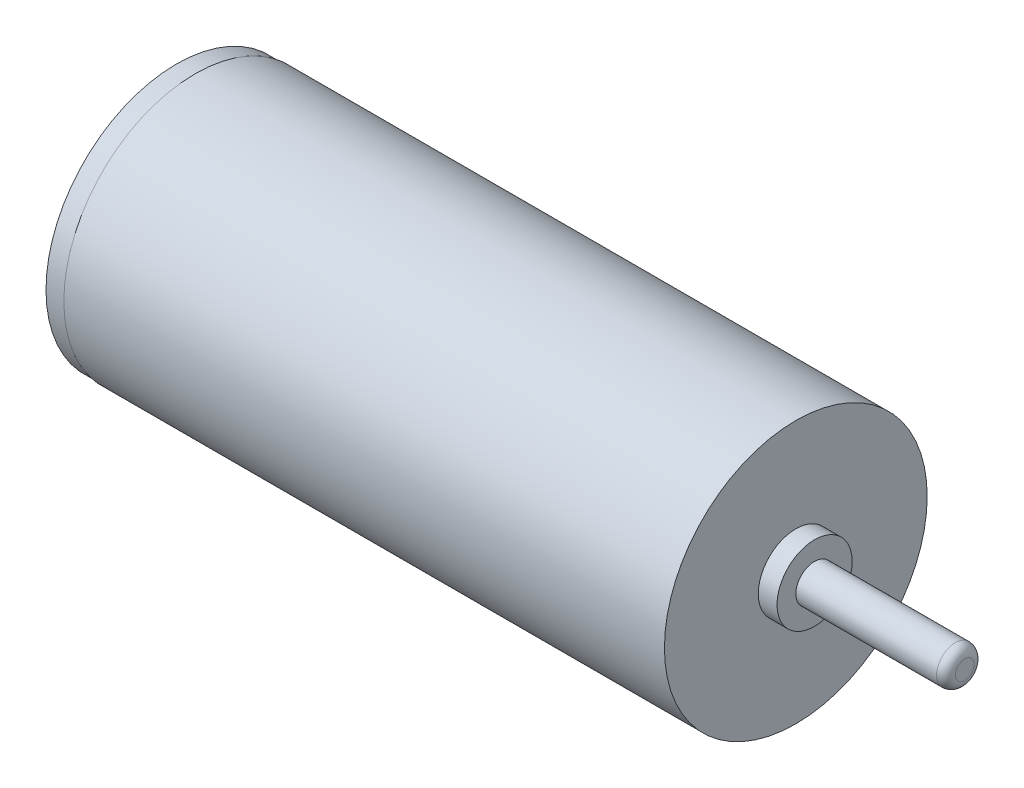
ISO-10303-21;
HEADER;
FILE_DESCRIPTION(('STEP AP214'),'2;1');
FILE_NAME('part.step','',(''),(''),'','','');
FILE_SCHEMA(('AUTOMOTIVE_DESIGN { 1 0 10303 214 1 1 1 1 }'));
ENDSEC;
DATA;
#1=APPLICATION_CONTEXT('core data for automotive mechanical design processes');
#2=APPLICATION_PROTOCOL_DEFINITION('international standard','automotive_design',2000,#1);
#3=PRODUCT_CONTEXT('',#1,'mechanical');
#4=PRODUCT('Part','Part','',(#3));
#5=PRODUCT_RELATED_PRODUCT_CATEGORY('part','',(#4));
#6=PRODUCT_DEFINITION_FORMATION('','',#4);
#7=PRODUCT_DEFINITION_CONTEXT('part definition',#1,'design');
#8=PRODUCT_DEFINITION('design','',#6,#7);
#9=PRODUCT_DEFINITION_SHAPE('','',#8);
#10=(LENGTH_UNIT() NAMED_UNIT(*) SI_UNIT(.MILLI.,.METRE.));
#11=(NAMED_UNIT(*) PLANE_ANGLE_UNIT() SI_UNIT($,.RADIAN.));
#12=(NAMED_UNIT(*) SI_UNIT($,.STERADIAN.) SOLID_ANGLE_UNIT());
#13=UNCERTAINTY_MEASURE_WITH_UNIT(LENGTH_MEASURE(1.E-05),#10,'distance_accuracy_value','');
#14=(GEOMETRIC_REPRESENTATION_CONTEXT(3) GLOBAL_UNCERTAINTY_ASSIGNED_CONTEXT((#13)) GLOBAL_UNIT_ASSIGNED_CONTEXT((#10,
#11,#12)) REPRESENTATION_CONTEXT('',''));
#15=CARTESIAN_POINT('',(0.,0.,0.));
#16=DIRECTION('',(0.,0.,1.));
#17=DIRECTION('',(1.,0.,0.));
#18=AXIS2_PLACEMENT_3D('',#15,#16,#17);
#19=CARTESIAN_POINT('',(-16.5,0.,0.));
#20=DIRECTION('',(-1.,0.,0.));
#21=DIRECTION('',(0.,0.,1.));
#22=AXIS2_PLACEMENT_3D('',#19,#20,#21);
#23=PLANE('',#22);
#24=CARTESIAN_POINT('',(-16.5,0.,0.));
#25=DIRECTION('',(-1.,0.,0.));
#26=DIRECTION('',(0.,0.,1.));
#27=AXIS2_PLACEMENT_3D('',#24,#25,#26);
#28=CIRCLE('',#27,3.475);
#29=CARTESIAN_POINT('',(-16.5,0.,3.475));
#30=VERTEX_POINT('',#29);
#31=EDGE_CURVE('E63',#30,#30,#28,.T.);
#32=ORIENTED_EDGE('',*,*,#31,.T.);
#33=EDGE_LOOP('',(#32));
#34=FACE_BOUND('',#33,.T.);
#35=CARTESIAN_POINT('',(-16.5,0.,0.));
#36=DIRECTION('',(-1.,0.,0.));
#37=DIRECTION('',(0.,0.,1.));
#38=AXIS2_PLACEMENT_3D('',#35,#36,#37);
#39=CIRCLE('',#38,1.);
#40=CARTESIAN_POINT('',(-16.5,0.,1.));
#41=VERTEX_POINT('',#40);
#42=EDGE_CURVE('E67',#41,#41,#39,.T.);
#43=ORIENTED_EDGE('',*,*,#42,.F.);
#44=EDGE_LOOP('',(#43));
#45=FACE_BOUND('',#44,.T.);
#46=ADVANCED_FACE('F31',(#34,#45),#23,.T.);
#47=CARTESIAN_POINT('',(-16.,0.,0.));
#48=DIRECTION('',(1.,0.,0.));
#49=DIRECTION('',(0.,0.,-1.));
#50=AXIS2_PLACEMENT_3D('',#47,#48,#49);
#51=PLANE('',#50);
#52=CARTESIAN_POINT('',(-16.,0.,0.));
#53=DIRECTION('',(1.,0.,0.));
#54=DIRECTION('',(0.,0.,-1.));
#55=AXIS2_PLACEMENT_3D('',#52,#53,#54);
#56=CIRCLE('',#55,3.5);
#57=CARTESIAN_POINT('',(-16.,0.,-3.5));
#58=VERTEX_POINT('',#57);
#59=EDGE_CURVE('E46',#58,#58,#56,.T.);
#60=ORIENTED_EDGE('',*,*,#59,.F.);
#61=EDGE_LOOP('',(#60));
#62=FACE_BOUND('',#61,.T.);
#63=CARTESIAN_POINT('',(-16.,0.,0.));
#64=DIRECTION('',(1.,0.,0.));
#65=DIRECTION('',(0.,0.,-1.));
#66=AXIS2_PLACEMENT_3D('',#63,#64,#65);
#67=CIRCLE('',#66,3.475);
#68=CARTESIAN_POINT('',(-16.,0.,-3.475));
#69=VERTEX_POINT('',#68);
#70=EDGE_CURVE('E10',#69,#69,#67,.F.);
#71=ORIENTED_EDGE('',*,*,#70,.F.);
#72=EDGE_LOOP('',(#71));
#73=FACE_BOUND('',#72,.T.);
#74=ADVANCED_FACE('F83',(#62,#73),#51,.F.);
#75=CARTESIAN_POINT('',(0.5,0.,0.));
#76=DIRECTION('',(1.,0.,0.));
#77=DIRECTION('',(0.,0.,-1.));
#78=AXIS2_PLACEMENT_3D('',#75,#76,#77);
#79=PLANE('',#78);
#80=CARTESIAN_POINT('',(0.5,0.,0.));
#81=DIRECTION('',(1.,0.,0.));
#82=DIRECTION('',(0.,0.,-1.));
#83=AXIS2_PLACEMENT_3D('',#80,#81,#82);
#84=CIRCLE('',#83,1.);
#85=CARTESIAN_POINT('',(0.5,0.,-1.));
#86=VERTEX_POINT('',#85);
#87=EDGE_CURVE('E52',#86,#86,#84,.T.);
#88=ORIENTED_EDGE('',*,*,#87,.T.);
#89=EDGE_LOOP('',(#88));
#90=FACE_BOUND('',#89,.T.);
#91=CARTESIAN_POINT('',(0.5,0.,0.));
#92=DIRECTION('',(1.,0.,0.));
#93=DIRECTION('',(0.,0.,-1.));
#94=AXIS2_PLACEMENT_3D('',#91,#92,#93);
#95=CIRCLE('',#94,0.5);
#96=CARTESIAN_POINT('',(0.5,0.,-0.5));
#97=VERTEX_POINT('',#96);
#98=EDGE_CURVE('E58',#97,#97,#95,.T.);
#99=ORIENTED_EDGE('',*,*,#98,.F.);
#100=EDGE_LOOP('',(#99));
#101=FACE_BOUND('',#100,.T.);
#102=ADVANCED_FACE('F89',(#90,#101),#79,.T.);
#103=CARTESIAN_POINT('',(0.,0.,0.));
#104=DIRECTION('',(1.,0.,0.));
#105=DIRECTION('',(0.,0.,-1.));
#106=AXIS2_PLACEMENT_3D('',#103,#104,#105);
#107=PLANE('',#106);
#108=CARTESIAN_POINT('',(0.,0.,0.));
#109=DIRECTION('',(1.,0.,0.));
#110=DIRECTION('',(0.,0.,-1.));
#111=AXIS2_PLACEMENT_3D('',#108,#109,#110);
#112=CIRCLE('',#111,3.5);
#113=CARTESIAN_POINT('',(0.,0.,-3.5));
#114=VERTEX_POINT('',#113);
#115=EDGE_CURVE('E49',#114,#114,#112,.T.);
#116=ORIENTED_EDGE('',*,*,#115,.T.);
#117=EDGE_LOOP('',(#116));
#118=FACE_BOUND('',#117,.T.);
#119=CARTESIAN_POINT('',(0.,0.,0.));
#120=DIRECTION('',(1.,0.,0.));
#121=DIRECTION('',(0.,0.,-1.));
#122=AXIS2_PLACEMENT_3D('',#119,#120,#121);
#123=CIRCLE('',#122,1.);
#124=CARTESIAN_POINT('',(0.,0.,-1.));
#125=VERTEX_POINT('',#124);
#126=EDGE_CURVE('E55',#125,#125,#123,.T.);
#127=ORIENTED_EDGE('',*,*,#126,.F.);
#128=EDGE_LOOP('',(#127));
#129=FACE_BOUND('',#128,.T.);
#130=ADVANCED_FACE('F107',(#118,#129),#107,.T.);
#131=CARTESIAN_POINT('',(-16.,0.,0.));
#132=DIRECTION('',(1.,0.,0.));
#133=DIRECTION('',(0.,0.,-1.));
#134=AXIS2_PLACEMENT_3D('',#131,#132,#133);
#135=CYLINDRICAL_SURFACE('',#134,3.5);
#136=ORIENTED_EDGE('',*,*,#59,.T.);
#137=EDGE_LOOP('',(#136));
#138=FACE_BOUND('',#137,.T.);
#139=ORIENTED_EDGE('',*,*,#115,.F.);
#140=EDGE_LOOP('',(#139));
#141=FACE_BOUND('',#140,.T.);
#142=ADVANCED_FACE('F110',(#138,#141),#135,.T.);
#143=CARTESIAN_POINT('',(0.5,0.,0.));
#144=DIRECTION('',(-1.,0.,0.));
#145=DIRECTION('',(0.,0.,1.));
#146=AXIS2_PLACEMENT_3D('',#143,#144,#145);
#147=CYLINDRICAL_SURFACE('',#146,1.);
#148=ORIENTED_EDGE('',*,*,#87,.F.);
#149=EDGE_LOOP('',(#148));
#150=FACE_BOUND('',#149,.T.);
#151=ORIENTED_EDGE('',*,*,#126,.T.);
#152=EDGE_LOOP('',(#151));
#153=FACE_BOUND('',#152,.T.);
#154=ADVANCED_FACE('F104',(#150,#153),#147,.T.);
#155=CARTESIAN_POINT('',(4.5,0.,0.));
#156=DIRECTION('',(-1.,0.,0.));
#157=DIRECTION('',(0.,0.,1.));
#158=AXIS2_PLACEMENT_3D('',#155,#156,#157);
#159=CYLINDRICAL_SURFACE('',#158,0.5);
#160=CARTESIAN_POINT('',(4.25,0.,0.));
#161=DIRECTION('',(1.,0.,0.));
#162=DIRECTION('',(0.,0.,-1.));
#163=AXIS2_PLACEMENT_3D('',#160,#161,#162);
#164=CIRCLE('',#163,0.5);
#165=CARTESIAN_POINT('',(4.25,0.,-0.5));
#166=VERTEX_POINT('',#165);
#167=EDGE_CURVE('E38',#166,#166,#164,.F.);
#168=ORIENTED_EDGE('',*,*,#167,.T.);
#169=EDGE_LOOP('',(#168));
#170=FACE_BOUND('',#169,.T.);
#171=ORIENTED_EDGE('',*,*,#98,.T.);
#172=EDGE_LOOP('',(#171));
#173=FACE_BOUND('',#172,.T.);
#174=ADVANCED_FACE('F100',(#170,#173),#159,.T.);
#175=CARTESIAN_POINT('',(4.5,0.,0.));
#176=DIRECTION('',(1.,0.,0.));
#177=DIRECTION('',(0.,0.,-1.));
#178=AXIS2_PLACEMENT_3D('',#175,#176,#177);
#179=PLANE('',#178);
#180=CARTESIAN_POINT('',(4.5,0.,0.));
#181=DIRECTION('',(1.,0.,0.));
#182=DIRECTION('',(0.,0.,-1.));
#183=AXIS2_PLACEMENT_3D('',#180,#181,#182);
#184=CIRCLE('',#183,0.25);
#185=CARTESIAN_POINT('',(4.5,0.,-0.25));
#186=VERTEX_POINT('',#185);
#187=EDGE_CURVE('E42',#186,#186,#184,.T.);
#188=ORIENTED_EDGE('',*,*,#187,.T.);
#189=EDGE_LOOP('',(#188));
#190=FACE_BOUND('',#189,.T.);
#191=ADVANCED_FACE('F97',(#190),#179,.T.);
#192=CARTESIAN_POINT('',(4.25,0.,0.));
#193=DIRECTION('',(1.,0.,0.));
#194=DIRECTION('',(0.,0.,-1.));
#195=AXIS2_PLACEMENT_3D('',#192,#193,#194);
#196=DEGENERATE_TOROIDAL_SURFACE('',#195,0.25,0.25,.T.);
#197=ORIENTED_EDGE('',*,*,#167,.F.);
#198=EDGE_LOOP('',(#197));
#199=FACE_BOUND('',#198,.T.);
#200=ORIENTED_EDGE('',*,*,#187,.F.);
#201=EDGE_LOOP('',(#200));
#202=FACE_BOUND('',#201,.T.);
#203=ADVANCED_FACE('F33',(#199,#202),#196,.T.);
#204=CARTESIAN_POINT('',(-16.5,0.,0.));
#205=DIRECTION('',(1.,0.,0.));
#206=DIRECTION('',(0.,0.,-1.));
#207=AXIS2_PLACEMENT_3D('',#204,#205,#206);
#208=CYLINDRICAL_SURFACE('',#207,3.475);
#209=ORIENTED_EDGE('',*,*,#31,.F.);
#210=EDGE_LOOP('',(#209));
#211=FACE_BOUND('',#210,.T.);
#212=ORIENTED_EDGE('',*,*,#70,.T.);
#213=EDGE_LOOP('',(#212));
#214=FACE_BOUND('',#213,.T.);
#215=ADVANCED_FACE('F78',(#211,#214),#208,.T.);
#216=CARTESIAN_POINT('',(-17.5,0.,0.));
#217=DIRECTION('',(1.,0.,0.));
#218=DIRECTION('',(0.,0.,-1.));
#219=AXIS2_PLACEMENT_3D('',#216,#217,#218);
#220=CYLINDRICAL_SURFACE('',#219,1.);
#221=CARTESIAN_POINT('',(-17.5,0.,0.));
#222=DIRECTION('',(-1.,0.,0.));
#223=DIRECTION('',(0.,0.,1.));
#224=AXIS2_PLACEMENT_3D('',#221,#222,#223);
#225=CIRCLE('',#224,1.);
#226=CARTESIAN_POINT('',(-17.5,0.,1.));
#227=VERTEX_POINT('',#226);
#228=EDGE_CURVE('E66',#227,#227,#225,.T.);
#229=ORIENTED_EDGE('',*,*,#228,.F.);
#230=EDGE_LOOP('',(#229));
#231=FACE_BOUND('',#230,.T.);
#232=ORIENTED_EDGE('',*,*,#42,.T.);
#233=EDGE_LOOP('',(#232));
#234=FACE_BOUND('',#233,.T.);
#235=ADVANCED_FACE('F75',(#231,#234),#220,.T.);
#236=CARTESIAN_POINT('',(-17.5,0.,0.));
#237=DIRECTION('',(-1.,0.,0.));
#238=DIRECTION('',(0.,0.,1.));
#239=AXIS2_PLACEMENT_3D('',#236,#237,#238);
#240=PLANE('',#239);
#241=ORIENTED_EDGE('',*,*,#228,.T.);
#242=EDGE_LOOP('',(#241));
#243=FACE_BOUND('',#242,.T.);
#244=ADVANCED_FACE('F73',(#243),#240,.T.);
#245=CLOSED_SHELL('',(#46,#74,#102,#130,#142,#154,#174,#191,#203,#215,#235,#244));
#246=MANIFOLD_SOLID_BREP('B2',#245);
#247=ADVANCED_BREP_SHAPE_REPRESENTATION('',(#18,#246),#14);
#248=SHAPE_DEFINITION_REPRESENTATION(#9,#247);
ENDSEC;
END-ISO-10303-21;
